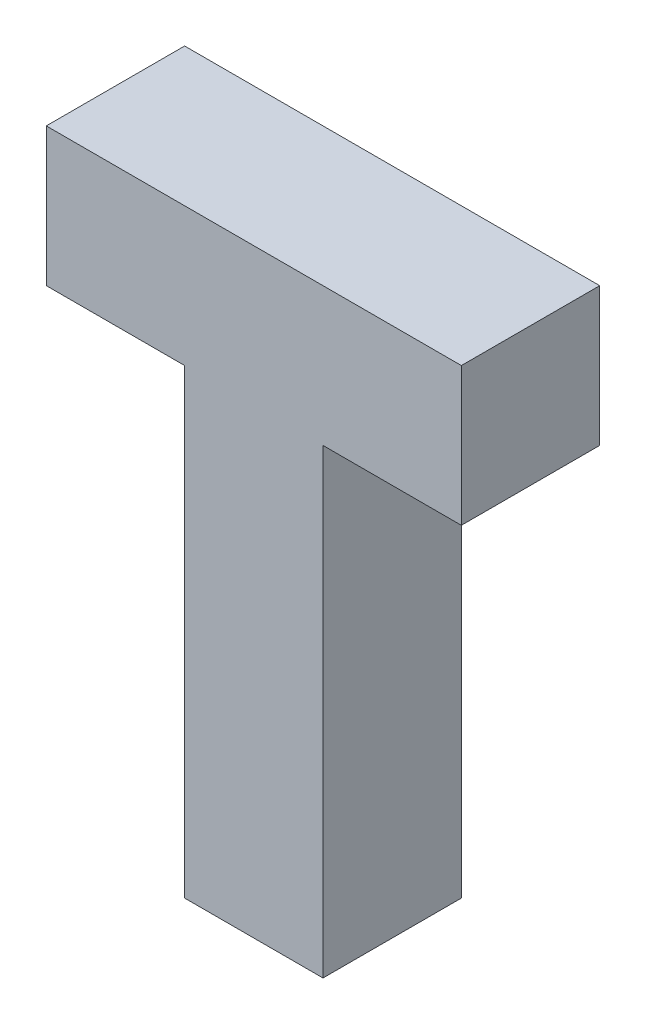
ISO-10303-21;
HEADER;
FILE_DESCRIPTION(('STEP AP214'),'2;1');
FILE_NAME('part.step','',(''),(''),'','','');
FILE_SCHEMA(('AUTOMOTIVE_DESIGN { 1 0 10303 214 1 1 1 1 }'));
ENDSEC;
DATA;
#1=APPLICATION_CONTEXT('core data for automotive mechanical design processes');
#2=APPLICATION_PROTOCOL_DEFINITION('international standard','automotive_design',2000,#1);
#3=PRODUCT_CONTEXT('',#1,'mechanical');
#4=PRODUCT('Part','Part','',(#3));
#5=PRODUCT_RELATED_PRODUCT_CATEGORY('part','',(#4));
#6=PRODUCT_DEFINITION_FORMATION('','',#4);
#7=PRODUCT_DEFINITION_CONTEXT('part definition',#1,'design');
#8=PRODUCT_DEFINITION('design','',#6,#7);
#9=PRODUCT_DEFINITION_SHAPE('','',#8);
#10=(LENGTH_UNIT() NAMED_UNIT(*) SI_UNIT(.MILLI.,.METRE.));
#11=(NAMED_UNIT(*) PLANE_ANGLE_UNIT() SI_UNIT($,.RADIAN.));
#12=(NAMED_UNIT(*) SI_UNIT($,.STERADIAN.) SOLID_ANGLE_UNIT());
#13=UNCERTAINTY_MEASURE_WITH_UNIT(LENGTH_MEASURE(1.E-05),#10,'distance_accuracy_value','');
#14=(GEOMETRIC_REPRESENTATION_CONTEXT(3) GLOBAL_UNCERTAINTY_ASSIGNED_CONTEXT((#13)) GLOBAL_UNIT_ASSIGNED_CONTEXT((#10,
#11,#12)) REPRESENTATION_CONTEXT('',''));
#15=CARTESIAN_POINT('',(0.,0.,0.));
#16=DIRECTION('',(0.,0.,1.));
#17=DIRECTION('',(1.,0.,0.));
#18=AXIS2_PLACEMENT_3D('',#15,#16,#17);
#19=CARTESIAN_POINT('',(-2.20482831009147,6.36166900408386,3.));
#20=DIRECTION('',(0.,-1.,0.));
#21=DIRECTION('',(0.,0.,-1.));
#22=AXIS2_PLACEMENT_3D('',#19,#20,#21);
#23=PLANE('',#22);
#24=DIRECTION('',(-1.,0.,0.));
#25=VECTOR('',#24,1.);
#26=CARTESIAN_POINT('',(-2.20482831009147,6.36166900408386,0.));
#27=LINE('',#26,#25);
#28=CARTESIAN_POINT('',(6.79517168990853,6.36166900408386,0.));
#29=VERTEX_POINT('',#28);
#30=CARTESIAN_POINT('',(-2.20482831009147,6.36166900408386,0.));
#31=VERTEX_POINT('',#30);
#32=EDGE_CURVE('E140',#29,#31,#27,.T.);
#33=ORIENTED_EDGE('',*,*,#32,.T.);
#34=DIRECTION('',(0.,0.,-1.));
#35=VECTOR('',#34,1.);
#36=CARTESIAN_POINT('',(-2.20482831009147,6.36166900408386,3.));
#37=LINE('',#36,#35);
#38=CARTESIAN_POINT('',(-2.20482831009147,6.36166900408386,3.));
#39=VERTEX_POINT('',#38);
#40=EDGE_CURVE('E11',#39,#31,#37,.T.);
#41=ORIENTED_EDGE('',*,*,#40,.F.);
#42=DIRECTION('',(-1.,0.,0.));
#43=VECTOR('',#42,1.);
#44=CARTESIAN_POINT('',(-2.20482831009147,6.36166900408386,3.));
#45=LINE('',#44,#43);
#46=CARTESIAN_POINT('',(6.79517168990853,6.36166900408386,3.));
#47=VERTEX_POINT('',#46);
#48=EDGE_CURVE('E162',#47,#39,#45,.T.);
#49=ORIENTED_EDGE('',*,*,#48,.F.);
#50=DIRECTION('',(0.,0.,-1.));
#51=VECTOR('',#50,1.);
#52=CARTESIAN_POINT('',(6.79517168990853,6.36166900408386,3.));
#53=LINE('',#52,#51);
#54=EDGE_CURVE('E136',#47,#29,#53,.T.);
#55=ORIENTED_EDGE('',*,*,#54,.T.);
#56=EDGE_LOOP('',(#33,#41,#49,#55));
#57=FACE_BOUND('',#56,.T.);
#58=ADVANCED_FACE('F39',(#57),#23,.F.);
#59=CARTESIAN_POINT('',(-2.20482831009147,6.36166900408386,3.));
#60=DIRECTION('',(1.,0.,0.));
#61=DIRECTION('',(0.,0.,-1.));
#62=AXIS2_PLACEMENT_3D('',#59,#60,#61);
#63=PLANE('',#62);
#64=DIRECTION('',(0.,-1.,0.));
#65=VECTOR('',#64,1.);
#66=CARTESIAN_POINT('',(-2.20482831009147,6.36166900408386,0.));
#67=LINE('',#66,#65);
#68=CARTESIAN_POINT('',(-2.20482831009147,3.36166900408386,0.));
#69=VERTEX_POINT('',#68);
#70=EDGE_CURVE('E144',#31,#69,#67,.T.);
#71=ORIENTED_EDGE('',*,*,#70,.T.);
#72=DIRECTION('',(0.,0.,-1.));
#73=VECTOR('',#72,1.);
#74=CARTESIAN_POINT('',(-2.20482831009147,3.36166900408386,3.));
#75=LINE('',#74,#73);
#76=CARTESIAN_POINT('',(-2.20482831009147,3.36166900408386,3.));
#77=VERTEX_POINT('',#76);
#78=EDGE_CURVE('E48',#77,#69,#75,.T.);
#79=ORIENTED_EDGE('',*,*,#78,.F.);
#80=DIRECTION('',(0.,-1.,0.));
#81=VECTOR('',#80,1.);
#82=CARTESIAN_POINT('',(-2.20482831009147,6.36166900408386,3.));
#83=LINE('',#82,#81);
#84=EDGE_CURVE('E99',#39,#77,#83,.T.);
#85=ORIENTED_EDGE('',*,*,#84,.F.);
#86=ORIENTED_EDGE('',*,*,#40,.T.);
#87=EDGE_LOOP('',(#71,#79,#85,#86));
#88=FACE_BOUND('',#87,.T.);
#89=ADVANCED_FACE('F208',(#88),#63,.F.);
#90=CARTESIAN_POINT('',(-2.20482831009147,3.36166900408386,3.));
#91=DIRECTION('',(0.,1.,0.));
#92=DIRECTION('',(0.,0.,1.));
#93=AXIS2_PLACEMENT_3D('',#90,#91,#92);
#94=PLANE('',#93);
#95=DIRECTION('',(1.,0.,0.));
#96=VECTOR('',#95,1.);
#97=CARTESIAN_POINT('',(-2.20482831009147,3.36166900408386,0.));
#98=LINE('',#97,#96);
#99=CARTESIAN_POINT('',(0.79517168990853,3.36166900408386,0.));
#100=VERTEX_POINT('',#99);
#101=EDGE_CURVE('E147',#69,#100,#98,.T.);
#102=ORIENTED_EDGE('',*,*,#101,.T.);
#103=DIRECTION('',(0.,0.,-1.));
#104=VECTOR('',#103,1.);
#105=CARTESIAN_POINT('',(0.79517168990853,3.36166900408386,3.));
#106=LINE('',#105,#104);
#107=CARTESIAN_POINT('',(0.79517168990853,3.36166900408386,3.));
#108=VERTEX_POINT('',#107);
#109=EDGE_CURVE('E173',#108,#100,#106,.T.);
#110=ORIENTED_EDGE('',*,*,#109,.F.);
#111=DIRECTION('',(1.,0.,0.));
#112=VECTOR('',#111,1.);
#113=CARTESIAN_POINT('',(-2.20482831009147,3.36166900408386,3.));
#114=LINE('',#113,#112);
#115=EDGE_CURVE('E183',#77,#108,#114,.T.);
#116=ORIENTED_EDGE('',*,*,#115,.F.);
#117=ORIENTED_EDGE('',*,*,#78,.T.);
#118=EDGE_LOOP('',(#102,#110,#116,#117));
#119=FACE_BOUND('',#118,.T.);
#120=ADVANCED_FACE('F181',(#119),#94,.F.);
#121=CARTESIAN_POINT('',(0.79517168990853,3.36166900408386,3.));
#122=DIRECTION('',(1.,0.,0.));
#123=DIRECTION('',(0.,1.,0.));
#124=AXIS2_PLACEMENT_3D('',#121,#122,#123);
#125=PLANE('',#124);
#126=DIRECTION('',(0.,-1.,0.));
#127=VECTOR('',#126,1.);
#128=CARTESIAN_POINT('',(0.79517168990853,3.36166900408386,0.));
#129=LINE('',#128,#127);
#130=CARTESIAN_POINT('',(0.795171689908529,-6.63833099591614,0.));
#131=VERTEX_POINT('',#130);
#132=EDGE_CURVE('E150',#100,#131,#129,.T.);
#133=ORIENTED_EDGE('',*,*,#132,.T.);
#134=DIRECTION('',(0.,0.,-1.));
#135=VECTOR('',#134,1.);
#136=CARTESIAN_POINT('',(0.795171689908529,-6.63833099591614,3.));
#137=LINE('',#136,#135);
#138=CARTESIAN_POINT('',(0.795171689908529,-6.63833099591614,3.));
#139=VERTEX_POINT('',#138);
#140=EDGE_CURVE('E169',#139,#131,#137,.T.);
#141=ORIENTED_EDGE('',*,*,#140,.F.);
#142=DIRECTION('',(0.,-1.,0.));
#143=VECTOR('',#142,1.);
#144=CARTESIAN_POINT('',(0.79517168990853,3.36166900408386,3.));
#145=LINE('',#144,#143);
#146=EDGE_CURVE('E196',#108,#139,#145,.T.);
#147=ORIENTED_EDGE('',*,*,#146,.F.);
#148=ORIENTED_EDGE('',*,*,#109,.T.);
#149=EDGE_LOOP('',(#133,#141,#147,#148));
#150=FACE_BOUND('',#149,.T.);
#151=ADVANCED_FACE('F191',(#150),#125,.F.);
#152=CARTESIAN_POINT('',(0.795171689908529,-6.63833099591614,3.));
#153=DIRECTION('',(0.,1.,0.));
#154=DIRECTION('',(0.,0.,1.));
#155=AXIS2_PLACEMENT_3D('',#152,#153,#154);
#156=PLANE('',#155);
#157=DIRECTION('',(1.,0.,0.));
#158=VECTOR('',#157,1.);
#159=CARTESIAN_POINT('',(0.795171689908529,-6.63833099591614,0.));
#160=LINE('',#159,#158);
#161=CARTESIAN_POINT('',(3.79517168990853,-6.63833099591614,0.));
#162=VERTEX_POINT('',#161);
#163=EDGE_CURVE('E153',#131,#162,#160,.T.);
#164=ORIENTED_EDGE('',*,*,#163,.T.);
#165=DIRECTION('',(0.,0.,-1.));
#166=VECTOR('',#165,1.);
#167=CARTESIAN_POINT('',(3.79517168990853,-6.63833099591614,3.));
#168=LINE('',#167,#166);
#169=CARTESIAN_POINT('',(3.79517168990853,-6.63833099591614,3.));
#170=VERTEX_POINT('',#169);
#171=EDGE_CURVE('E129',#170,#162,#168,.T.);
#172=ORIENTED_EDGE('',*,*,#171,.F.);
#173=DIRECTION('',(1.,0.,0.));
#174=VECTOR('',#173,1.);
#175=CARTESIAN_POINT('',(0.795171689908529,-6.63833099591614,3.));
#176=LINE('',#175,#174);
#177=EDGE_CURVE('E118',#139,#170,#176,.T.);
#178=ORIENTED_EDGE('',*,*,#177,.F.);
#179=ORIENTED_EDGE('',*,*,#140,.T.);
#180=EDGE_LOOP('',(#164,#172,#178,#179));
#181=FACE_BOUND('',#180,.T.);
#182=ADVANCED_FACE('F194',(#181),#156,.F.);
#183=CARTESIAN_POINT('',(3.79517168990853,-6.63833099591614,3.));
#184=DIRECTION('',(-1.,0.,0.));
#185=DIRECTION('',(0.,0.,1.));
#186=AXIS2_PLACEMENT_3D('',#183,#184,#185);
#187=PLANE('',#186);
#188=DIRECTION('',(0.,1.,0.));
#189=VECTOR('',#188,1.);
#190=CARTESIAN_POINT('',(3.79517168990853,-6.63833099591614,0.));
#191=LINE('',#190,#189);
#192=CARTESIAN_POINT('',(3.79517168990853,3.36166900408386,0.));
#193=VERTEX_POINT('',#192);
#194=EDGE_CURVE('E127',#162,#193,#191,.T.);
#195=ORIENTED_EDGE('',*,*,#194,.T.);
#196=DIRECTION('',(0.,0.,-1.));
#197=VECTOR('',#196,1.);
#198=CARTESIAN_POINT('',(3.79517168990853,3.36166900408386,3.));
#199=LINE('',#198,#197);
#200=CARTESIAN_POINT('',(3.79517168990853,3.36166900408386,3.));
#201=VERTEX_POINT('',#200);
#202=EDGE_CURVE('E124',#201,#193,#199,.T.);
#203=ORIENTED_EDGE('',*,*,#202,.F.);
#204=DIRECTION('',(0.,1.,0.));
#205=VECTOR('',#204,1.);
#206=CARTESIAN_POINT('',(3.79517168990853,-6.63833099591614,3.));
#207=LINE('',#206,#205);
#208=EDGE_CURVE('E112',#170,#201,#207,.T.);
#209=ORIENTED_EDGE('',*,*,#208,.F.);
#210=ORIENTED_EDGE('',*,*,#171,.T.);
#211=EDGE_LOOP('',(#195,#203,#209,#210));
#212=FACE_BOUND('',#211,.T.);
#213=ADVANCED_FACE('F125',(#212),#187,.F.);
#214=CARTESIAN_POINT('',(3.79517168990853,3.36166900408386,3.));
#215=DIRECTION('',(0.,1.,0.));
#216=DIRECTION('',(0.,0.,1.));
#217=AXIS2_PLACEMENT_3D('',#214,#215,#216);
#218=PLANE('',#217);
#219=DIRECTION('',(1.,0.,0.));
#220=VECTOR('',#219,1.);
#221=CARTESIAN_POINT('',(3.79517168990853,3.36166900408386,0.));
#222=LINE('',#221,#220);
#223=CARTESIAN_POINT('',(6.79517168990853,3.36166900408386,0.));
#224=VERTEX_POINT('',#223);
#225=EDGE_CURVE('E85',#193,#224,#222,.T.);
#226=ORIENTED_EDGE('',*,*,#225,.T.);
#227=DIRECTION('',(0.,0.,-1.));
#228=VECTOR('',#227,1.);
#229=CARTESIAN_POINT('',(6.79517168990853,3.36166900408386,3.));
#230=LINE('',#229,#228);
#231=CARTESIAN_POINT('',(6.79517168990853,3.36166900408386,3.));
#232=VERTEX_POINT('',#231);
#233=EDGE_CURVE('E130',#232,#224,#230,.T.);
#234=ORIENTED_EDGE('',*,*,#233,.F.);
#235=DIRECTION('',(1.,0.,0.));
#236=VECTOR('',#235,1.);
#237=CARTESIAN_POINT('',(3.79517168990853,3.36166900408386,3.));
#238=LINE('',#237,#236);
#239=EDGE_CURVE('E116',#201,#232,#238,.T.);
#240=ORIENTED_EDGE('',*,*,#239,.F.);
#241=ORIENTED_EDGE('',*,*,#202,.T.);
#242=EDGE_LOOP('',(#226,#234,#240,#241));
#243=FACE_BOUND('',#242,.T.);
#244=ADVANCED_FACE('F132',(#243),#218,.F.);
#245=CARTESIAN_POINT('',(6.79517168990853,3.36166900408386,3.));
#246=DIRECTION('',(-1.,0.,0.));
#247=DIRECTION('',(0.,-1.,0.));
#248=AXIS2_PLACEMENT_3D('',#245,#246,#247);
#249=PLANE('',#248);
#250=DIRECTION('',(0.,1.,0.));
#251=VECTOR('',#250,1.);
#252=CARTESIAN_POINT('',(6.79517168990853,3.36166900408386,0.));
#253=LINE('',#252,#251);
#254=EDGE_CURVE('E91',#224,#29,#253,.T.);
#255=ORIENTED_EDGE('',*,*,#254,.T.);
#256=ORIENTED_EDGE('',*,*,#54,.F.);
#257=DIRECTION('',(0.,1.,0.));
#258=VECTOR('',#257,1.);
#259=CARTESIAN_POINT('',(6.79517168990853,3.36166900408386,3.));
#260=LINE('',#259,#258);
#261=EDGE_CURVE('E56',#232,#47,#260,.T.);
#262=ORIENTED_EDGE('',*,*,#261,.F.);
#263=ORIENTED_EDGE('',*,*,#233,.T.);
#264=EDGE_LOOP('',(#255,#256,#262,#263));
#265=FACE_BOUND('',#264,.T.);
#266=ADVANCED_FACE('F224',(#265),#249,.F.);
#267=CARTESIAN_POINT('',(0.,0.,3.));
#268=DIRECTION('',(0.,0.,1.));
#269=DIRECTION('',(1.,0.,0.));
#270=AXIS2_PLACEMENT_3D('',#267,#268,#269);
#271=PLANE('',#270);
#272=ORIENTED_EDGE('',*,*,#48,.T.);
#273=ORIENTED_EDGE('',*,*,#84,.T.);
#274=ORIENTED_EDGE('',*,*,#115,.T.);
#275=ORIENTED_EDGE('',*,*,#146,.T.);
#276=ORIENTED_EDGE('',*,*,#177,.T.);
#277=ORIENTED_EDGE('',*,*,#208,.T.);
#278=ORIENTED_EDGE('',*,*,#239,.T.);
#279=ORIENTED_EDGE('',*,*,#261,.T.);
#280=EDGE_LOOP('',(#272,#273,#274,#275,#276,#277,#278,#279));
#281=FACE_BOUND('',#280,.T.);
#282=ADVANCED_FACE('F114',(#281),#271,.T.);
#283=CARTESIAN_POINT('',(0.,0.,0.));
#284=DIRECTION('',(0.,0.,1.));
#285=DIRECTION('',(1.,0.,0.));
#286=AXIS2_PLACEMENT_3D('',#283,#284,#285);
#287=PLANE('',#286);
#288=ORIENTED_EDGE('',*,*,#32,.F.);
#289=ORIENTED_EDGE('',*,*,#254,.F.);
#290=ORIENTED_EDGE('',*,*,#225,.F.);
#291=ORIENTED_EDGE('',*,*,#194,.F.);
#292=ORIENTED_EDGE('',*,*,#163,.F.);
#293=ORIENTED_EDGE('',*,*,#132,.F.);
#294=ORIENTED_EDGE('',*,*,#101,.F.);
#295=ORIENTED_EDGE('',*,*,#70,.F.);
#296=EDGE_LOOP('',(#288,#289,#290,#291,#292,#293,#294,#295));
#297=FACE_BOUND('',#296,.T.);
#298=ADVANCED_FACE('F187',(#297),#287,.F.);
#299=CLOSED_SHELL('',(#58,#89,#120,#151,#182,#213,#244,#266,#282,#298));
#300=MANIFOLD_SOLID_BREP('B2',#299);
#301=ADVANCED_BREP_SHAPE_REPRESENTATION('',(#18,#300),#14);
#302=SHAPE_DEFINITION_REPRESENTATION(#9,#301);
ENDSEC;
END-ISO-10303-21;
